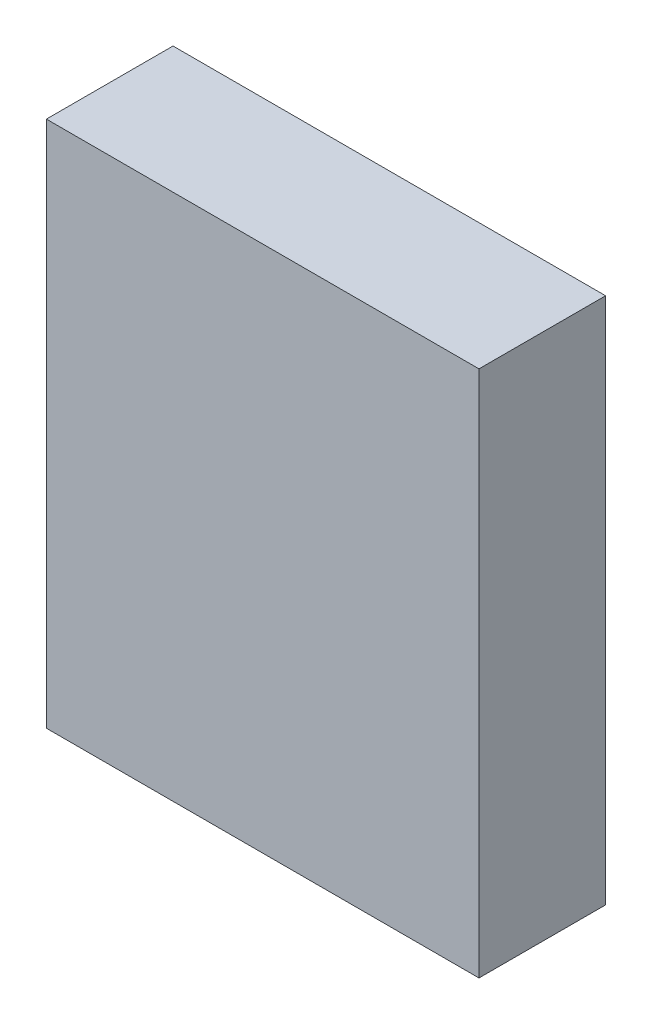
ISO-10303-21;
HEADER;
FILE_DESCRIPTION(('STEP AP214'),'2;1');
FILE_NAME('part.step','',(''),(''),'','','');
FILE_SCHEMA(('AUTOMOTIVE_DESIGN { 1 0 10303 214 1 1 1 1 }'));
ENDSEC;
DATA;
#1=APPLICATION_CONTEXT('core data for automotive mechanical design processes');
#2=APPLICATION_PROTOCOL_DEFINITION('international standard','automotive_design',2000,#1);
#3=PRODUCT_CONTEXT('',#1,'mechanical');
#4=PRODUCT('Part','Part','',(#3));
#5=PRODUCT_RELATED_PRODUCT_CATEGORY('part','',(#4));
#6=PRODUCT_DEFINITION_FORMATION('','',#4);
#7=PRODUCT_DEFINITION_CONTEXT('part definition',#1,'design');
#8=PRODUCT_DEFINITION('design','',#6,#7);
#9=PRODUCT_DEFINITION_SHAPE('','',#8);
#10=(LENGTH_UNIT() NAMED_UNIT(*) SI_UNIT(.MILLI.,.METRE.));
#11=(NAMED_UNIT(*) PLANE_ANGLE_UNIT() SI_UNIT($,.RADIAN.));
#12=(NAMED_UNIT(*) SI_UNIT($,.STERADIAN.) SOLID_ANGLE_UNIT());
#13=UNCERTAINTY_MEASURE_WITH_UNIT(LENGTH_MEASURE(1.E-05),#10,'distance_accuracy_value','');
#14=(GEOMETRIC_REPRESENTATION_CONTEXT(3) GLOBAL_UNCERTAINTY_ASSIGNED_CONTEXT((#13)) GLOBAL_UNIT_ASSIGNED_CONTEXT((#10,
#11,#12)) REPRESENTATION_CONTEXT('',''));
#15=CARTESIAN_POINT('',(0.,0.,0.));
#16=DIRECTION('',(0.,0.,1.));
#17=DIRECTION('',(1.,0.,0.));
#18=AXIS2_PLACEMENT_3D('',#15,#16,#17);
#19=CARTESIAN_POINT('',(2.20000068,-2.50000008,0.));
#20=DIRECTION('',(-1.,0.,0.));
#21=DIRECTION('',(0.,1.,0.));
#22=AXIS2_PLACEMENT_3D('',#19,#20,#21);
#23=PLANE('',#22);
#24=DIRECTION('',(0.,1.,0.));
#25=VECTOR('',#24,1.);
#26=CARTESIAN_POINT('',(2.20000068,-2.50000008,0.));
#27=LINE('',#26,#25);
#28=CARTESIAN_POINT('',(2.20000068,-2.50000008,0.));
#29=VERTEX_POINT('',#28);
#30=CARTESIAN_POINT('',(2.20000068,2.50000008,0.));
#31=VERTEX_POINT('',#30);
#32=EDGE_CURVE('E11',#29,#31,#27,.T.);
#33=ORIENTED_EDGE('',*,*,#32,.T.);
#34=DIRECTION('',(0.,0.,1.));
#35=VECTOR('',#34,1.);
#36=CARTESIAN_POINT('',(2.20000068,2.50000008,0.));
#37=LINE('',#36,#35);
#38=CARTESIAN_POINT('',(2.20000068,2.50000008,1.20000014));
#39=VERTEX_POINT('',#38);
#40=EDGE_CURVE('E23',#31,#39,#37,.T.);
#41=ORIENTED_EDGE('',*,*,#40,.T.);
#42=DIRECTION('',(0.,1.,0.));
#43=VECTOR('',#42,1.);
#44=CARTESIAN_POINT('',(2.20000068,-2.50000008,1.20000014));
#45=LINE('',#44,#43);
#46=CARTESIAN_POINT('',(2.20000068,-2.50000008,1.20000014));
#47=VERTEX_POINT('',#46);
#48=EDGE_CURVE('E86',#47,#39,#45,.T.);
#49=ORIENTED_EDGE('',*,*,#48,.F.);
#50=DIRECTION('',(0.,0.,1.));
#51=VECTOR('',#50,1.);
#52=CARTESIAN_POINT('',(2.20000068,-2.50000008,0.));
#53=LINE('',#52,#51);
#54=EDGE_CURVE('E37',#29,#47,#53,.T.);
#55=ORIENTED_EDGE('',*,*,#54,.F.);
#56=EDGE_LOOP('',(#33,#41,#49,#55));
#57=FACE_BOUND('',#56,.T.);
#58=ADVANCED_FACE('F16',(#57),#23,.F.);
#59=CARTESIAN_POINT('',(2.20000068,2.50000008,0.));
#60=DIRECTION('',(0.,-1.,0.));
#61=DIRECTION('',(-1.,0.,0.));
#62=AXIS2_PLACEMENT_3D('',#59,#60,#61);
#63=PLANE('',#62);
#64=DIRECTION('',(-1.,0.,0.));
#65=VECTOR('',#64,1.);
#66=CARTESIAN_POINT('',(2.20000068,2.50000008,0.));
#67=LINE('',#66,#65);
#68=CARTESIAN_POINT('',(-1.89999874,2.50000008,0.));
#69=VERTEX_POINT('',#68);
#70=EDGE_CURVE('E30',#31,#69,#67,.T.);
#71=ORIENTED_EDGE('',*,*,#70,.T.);
#72=DIRECTION('',(0.,0.,1.));
#73=VECTOR('',#72,1.);
#74=CARTESIAN_POINT('',(-1.89999874,2.50000008,0.));
#75=LINE('',#74,#73);
#76=CARTESIAN_POINT('',(-1.89999874,2.50000008,1.20000014));
#77=VERTEX_POINT('',#76);
#78=EDGE_CURVE('E82',#69,#77,#75,.T.);
#79=ORIENTED_EDGE('',*,*,#78,.T.);
#80=DIRECTION('',(-1.,0.,0.));
#81=VECTOR('',#80,1.);
#82=CARTESIAN_POINT('',(2.20000068,2.50000008,1.20000014));
#83=LINE('',#82,#81);
#84=EDGE_CURVE('E62',#39,#77,#83,.T.);
#85=ORIENTED_EDGE('',*,*,#84,.F.);
#86=ORIENTED_EDGE('',*,*,#40,.F.);
#87=EDGE_LOOP('',(#71,#79,#85,#86));
#88=FACE_BOUND('',#87,.T.);
#89=ADVANCED_FACE('F89',(#88),#63,.F.);
#90=CARTESIAN_POINT('',(-1.89999874,2.50000008,0.));
#91=DIRECTION('',(1.,0.,0.));
#92=DIRECTION('',(0.,-1.,0.));
#93=AXIS2_PLACEMENT_3D('',#90,#91,#92);
#94=PLANE('',#93);
#95=DIRECTION('',(0.,-1.,0.));
#96=VECTOR('',#95,1.);
#97=CARTESIAN_POINT('',(-1.89999874,2.50000008,0.));
#98=LINE('',#97,#96);
#99=CARTESIAN_POINT('',(-1.89999874,-2.50000008,0.));
#100=VERTEX_POINT('',#99);
#101=EDGE_CURVE('E71',#69,#100,#98,.T.);
#102=ORIENTED_EDGE('',*,*,#101,.T.);
#103=DIRECTION('',(0.,0.,1.));
#104=VECTOR('',#103,1.);
#105=CARTESIAN_POINT('',(-1.89999874,-2.50000008,0.));
#106=LINE('',#105,#104);
#107=CARTESIAN_POINT('',(-1.89999874,-2.50000008,1.20000014));
#108=VERTEX_POINT('',#107);
#109=EDGE_CURVE('E66',#100,#108,#106,.T.);
#110=ORIENTED_EDGE('',*,*,#109,.T.);
#111=DIRECTION('',(0.,-1.,0.));
#112=VECTOR('',#111,1.);
#113=CARTESIAN_POINT('',(-1.89999874,2.50000008,1.20000014));
#114=LINE('',#113,#112);
#115=EDGE_CURVE('E56',#77,#108,#114,.T.);
#116=ORIENTED_EDGE('',*,*,#115,.F.);
#117=ORIENTED_EDGE('',*,*,#78,.F.);
#118=EDGE_LOOP('',(#102,#110,#116,#117));
#119=FACE_BOUND('',#118,.T.);
#120=ADVANCED_FACE('F70',(#119),#94,.F.);
#121=CARTESIAN_POINT('',(-1.89999874,-2.50000008,0.));
#122=DIRECTION('',(0.,1.,0.));
#123=DIRECTION('',(1.,0.,0.));
#124=AXIS2_PLACEMENT_3D('',#121,#122,#123);
#125=PLANE('',#124);
#126=DIRECTION('',(1.,0.,0.));
#127=VECTOR('',#126,1.);
#128=CARTESIAN_POINT('',(-1.89999874,-2.50000008,0.));
#129=LINE('',#128,#127);
#130=EDGE_CURVE('E67',#100,#29,#129,.T.);
#131=ORIENTED_EDGE('',*,*,#130,.T.);
#132=ORIENTED_EDGE('',*,*,#54,.T.);
#133=DIRECTION('',(1.,0.,0.));
#134=VECTOR('',#133,1.);
#135=CARTESIAN_POINT('',(-1.89999874,-2.50000008,1.20000014));
#136=LINE('',#135,#134);
#137=EDGE_CURVE('E60',#108,#47,#136,.T.);
#138=ORIENTED_EDGE('',*,*,#137,.F.);
#139=ORIENTED_EDGE('',*,*,#109,.F.);
#140=EDGE_LOOP('',(#131,#132,#138,#139));
#141=FACE_BOUND('',#140,.T.);
#142=ADVANCED_FACE('F76',(#141),#125,.F.);
#143=CARTESIAN_POINT('',(0.150000970000041,0.,0.));
#144=DIRECTION('',(0.,0.,1.));
#145=DIRECTION('',(1.,0.,0.));
#146=AXIS2_PLACEMENT_3D('',#143,#144,#145);
#147=PLANE('',#146);
#148=ORIENTED_EDGE('',*,*,#130,.F.);
#149=ORIENTED_EDGE('',*,*,#101,.F.);
#150=ORIENTED_EDGE('',*,*,#70,.F.);
#151=ORIENTED_EDGE('',*,*,#32,.F.);
#152=EDGE_LOOP('',(#148,#149,#150,#151));
#153=FACE_BOUND('',#152,.T.);
#154=ADVANCED_FACE('F90',(#153),#147,.F.);
#155=CARTESIAN_POINT('',(0.150000970000041,0.,1.20000014));
#156=DIRECTION('',(0.,0.,1.));
#157=DIRECTION('',(1.,0.,0.));
#158=AXIS2_PLACEMENT_3D('',#155,#156,#157);
#159=PLANE('',#158);
#160=ORIENTED_EDGE('',*,*,#48,.T.);
#161=ORIENTED_EDGE('',*,*,#84,.T.);
#162=ORIENTED_EDGE('',*,*,#115,.T.);
#163=ORIENTED_EDGE('',*,*,#137,.T.);
#164=EDGE_LOOP('',(#160,#161,#162,#163));
#165=FACE_BOUND('',#164,.T.);
#166=ADVANCED_FACE('F58',(#165),#159,.T.);
#167=CLOSED_SHELL('',(#58,#89,#120,#142,#154,#166));
#168=MANIFOLD_SOLID_BREP('B1',#167);
#169=ADVANCED_BREP_SHAPE_REPRESENTATION('',(#18,#168),#14);
#170=SHAPE_DEFINITION_REPRESENTATION(#9,#169);
ENDSEC;
END-ISO-10303-21;
